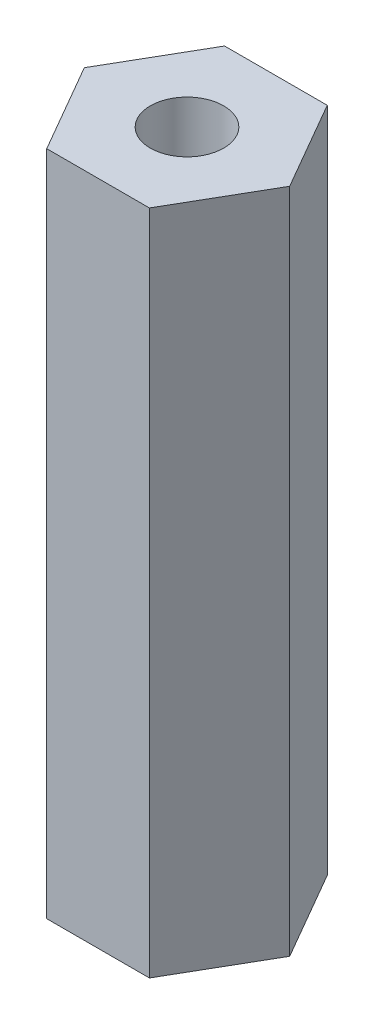
ISO-10303-21;
HEADER;
FILE_DESCRIPTION(('STEP AP214'),'2;1');
FILE_NAME('part.step','',(''),(''),'','','');
FILE_SCHEMA(('AUTOMOTIVE_DESIGN { 1 0 10303 214 1 1 1 1 }'));
ENDSEC;
DATA;
#1=APPLICATION_CONTEXT('core data for automotive mechanical design processes');
#2=APPLICATION_PROTOCOL_DEFINITION('international standard','automotive_design',2000,#1);
#3=PRODUCT_CONTEXT('',#1,'mechanical');
#4=PRODUCT('Part','Part','',(#3));
#5=PRODUCT_RELATED_PRODUCT_CATEGORY('part','',(#4));
#6=PRODUCT_DEFINITION_FORMATION('','',#4);
#7=PRODUCT_DEFINITION_CONTEXT('part definition',#1,'design');
#8=PRODUCT_DEFINITION('design','',#6,#7);
#9=PRODUCT_DEFINITION_SHAPE('','',#8);
#10=(LENGTH_UNIT() NAMED_UNIT(*) SI_UNIT(.MILLI.,.METRE.));
#11=(NAMED_UNIT(*) PLANE_ANGLE_UNIT() SI_UNIT($,.RADIAN.));
#12=(NAMED_UNIT(*) SI_UNIT($,.STERADIAN.) SOLID_ANGLE_UNIT());
#13=UNCERTAINTY_MEASURE_WITH_UNIT(LENGTH_MEASURE(1.E-05),#10,'distance_accuracy_value','');
#14=(GEOMETRIC_REPRESENTATION_CONTEXT(3) GLOBAL_UNCERTAINTY_ASSIGNED_CONTEXT((#13)) GLOBAL_UNIT_ASSIGNED_CONTEXT((#10,
#11,#12)) REPRESENTATION_CONTEXT('',''));
#15=CARTESIAN_POINT('',(0.,0.,0.));
#16=DIRECTION('',(0.,0.,1.));
#17=DIRECTION('',(1.,0.,0.));
#18=AXIS2_PLACEMENT_3D('',#15,#16,#17);
#19=CARTESIAN_POINT('',(0.,15.,4.));
#20=DIRECTION('',(0.,0.,-1.));
#21=DIRECTION('',(-1.,0.,0.));
#22=AXIS2_PLACEMENT_3D('',#19,#20,#21);
#23=PLANE('',#22);
#24=DIRECTION('',(1.,0.,0.));
#25=VECTOR('',#24,1.);
#26=CARTESIAN_POINT('',(0.,-15.,4.));
#27=LINE('',#26,#25);
#28=CARTESIAN_POINT('',(-2.3094010767585,-15.,4.));
#29=VERTEX_POINT('',#28);
#30=CARTESIAN_POINT('',(2.3094010767585,-15.,4.));
#31=VERTEX_POINT('',#30);
#32=EDGE_CURVE('E123',#29,#31,#27,.T.);
#33=ORIENTED_EDGE('',*,*,#32,.T.);
#34=DIRECTION('',(0.,-1.,0.));
#35=VECTOR('',#34,1.);
#36=CARTESIAN_POINT('',(2.3094010767585,15.,4.));
#37=LINE('',#36,#35);
#38=CARTESIAN_POINT('',(2.3094010767585,15.,4.));
#39=VERTEX_POINT('',#38);
#40=EDGE_CURVE('E11',#39,#31,#37,.T.);
#41=ORIENTED_EDGE('',*,*,#40,.F.);
#42=DIRECTION('',(1.,0.,0.));
#43=VECTOR('',#42,1.);
#44=CARTESIAN_POINT('',(0.,15.,4.));
#45=LINE('',#44,#43);
#46=CARTESIAN_POINT('',(-2.3094010767585,15.,4.));
#47=VERTEX_POINT('',#46);
#48=EDGE_CURVE('E146',#47,#39,#45,.T.);
#49=ORIENTED_EDGE('',*,*,#48,.F.);
#50=DIRECTION('',(0.,-1.,0.));
#51=VECTOR('',#50,1.);
#52=CARTESIAN_POINT('',(-2.3094010767585,15.,4.));
#53=LINE('',#52,#51);
#54=EDGE_CURVE('E116',#47,#29,#53,.T.);
#55=ORIENTED_EDGE('',*,*,#54,.T.);
#56=EDGE_LOOP('',(#33,#41,#49,#55));
#57=FACE_BOUND('',#56,.T.);
#58=ADVANCED_FACE('F35',(#57),#23,.F.);
#59=CARTESIAN_POINT('',(3.46410161513775,15.,2.));
#60=DIRECTION('',(-0.866025403784439,0.,-0.5));
#61=DIRECTION('',(-0.5,0.,0.866025403784439));
#62=AXIS2_PLACEMENT_3D('',#59,#60,#61);
#63=PLANE('',#62);
#64=DIRECTION('',(0.5,0.,-0.866025403784439));
#65=VECTOR('',#64,1.);
#66=CARTESIAN_POINT('',(3.46410161513775,-15.,2.));
#67=LINE('',#66,#65);
#68=CARTESIAN_POINT('',(4.618802153517,-15.,0.));
#69=VERTEX_POINT('',#68);
#70=EDGE_CURVE('E126',#31,#69,#67,.T.);
#71=ORIENTED_EDGE('',*,*,#70,.T.);
#72=DIRECTION('',(0.,-1.,0.));
#73=VECTOR('',#72,1.);
#74=CARTESIAN_POINT('',(4.618802153517,15.,0.));
#75=LINE('',#74,#73);
#76=CARTESIAN_POINT('',(4.618802153517,15.,0.));
#77=VERTEX_POINT('',#76);
#78=EDGE_CURVE('E44',#77,#69,#75,.T.);
#79=ORIENTED_EDGE('',*,*,#78,.F.);
#80=DIRECTION('',(0.5,0.,-0.866025403784439));
#81=VECTOR('',#80,1.);
#82=CARTESIAN_POINT('',(3.46410161513775,15.,2.));
#83=LINE('',#82,#81);
#84=EDGE_CURVE('E89',#39,#77,#83,.T.);
#85=ORIENTED_EDGE('',*,*,#84,.F.);
#86=ORIENTED_EDGE('',*,*,#40,.T.);
#87=EDGE_LOOP('',(#71,#79,#85,#86));
#88=FACE_BOUND('',#87,.T.);
#89=ADVANCED_FACE('F160',(#88),#63,.F.);
#90=CARTESIAN_POINT('',(3.46410161513775,15.,-2.));
#91=DIRECTION('',(-0.866025403784439,0.,0.5));
#92=DIRECTION('',(0.5,0.,0.866025403784439));
#93=AXIS2_PLACEMENT_3D('',#90,#91,#92);
#94=PLANE('',#93);
#95=DIRECTION('',(-0.5,0.,-0.866025403784439));
#96=VECTOR('',#95,1.);
#97=CARTESIAN_POINT('',(3.46410161513775,-15.,-2.));
#98=LINE('',#97,#96);
#99=CARTESIAN_POINT('',(2.3094010767585,-15.,-4.));
#100=VERTEX_POINT('',#99);
#101=EDGE_CURVE('E128',#69,#100,#98,.T.);
#102=ORIENTED_EDGE('',*,*,#101,.T.);
#103=DIRECTION('',(0.,-1.,0.));
#104=VECTOR('',#103,1.);
#105=CARTESIAN_POINT('',(2.3094010767585,15.,-4.));
#106=LINE('',#105,#104);
#107=CARTESIAN_POINT('',(2.3094010767585,15.,-4.));
#108=VERTEX_POINT('',#107);
#109=EDGE_CURVE('E111',#108,#100,#106,.T.);
#110=ORIENTED_EDGE('',*,*,#109,.F.);
#111=DIRECTION('',(-0.5,0.,-0.866025403784439));
#112=VECTOR('',#111,1.);
#113=CARTESIAN_POINT('',(3.46410161513775,15.,-2.));
#114=LINE('',#113,#112);
#115=EDGE_CURVE('E102',#77,#108,#114,.T.);
#116=ORIENTED_EDGE('',*,*,#115,.F.);
#117=ORIENTED_EDGE('',*,*,#78,.T.);
#118=EDGE_LOOP('',(#102,#110,#116,#117));
#119=FACE_BOUND('',#118,.T.);
#120=ADVANCED_FACE('F139',(#119),#94,.F.);
#121=CARTESIAN_POINT('',(0.,15.,-4.));
#122=DIRECTION('',(0.,0.,1.));
#123=DIRECTION('',(1.,0.,0.));
#124=AXIS2_PLACEMENT_3D('',#121,#122,#123);
#125=PLANE('',#124);
#126=DIRECTION('',(-1.,0.,0.));
#127=VECTOR('',#126,1.);
#128=CARTESIAN_POINT('',(0.,-15.,-4.));
#129=LINE('',#128,#127);
#130=CARTESIAN_POINT('',(-2.3094010767585,-15.,-4.));
#131=VERTEX_POINT('',#130);
#132=EDGE_CURVE('E110',#100,#131,#129,.T.);
#133=ORIENTED_EDGE('',*,*,#132,.T.);
#134=DIRECTION('',(0.,-1.,0.));
#135=VECTOR('',#134,1.);
#136=CARTESIAN_POINT('',(-2.3094010767585,15.,-4.));
#137=LINE('',#136,#135);
#138=CARTESIAN_POINT('',(-2.3094010767585,15.,-4.));
#139=VERTEX_POINT('',#138);
#140=EDGE_CURVE('E107',#139,#131,#137,.T.);
#141=ORIENTED_EDGE('',*,*,#140,.F.);
#142=DIRECTION('',(-1.,0.,0.));
#143=VECTOR('',#142,1.);
#144=CARTESIAN_POINT('',(0.,15.,-4.));
#145=LINE('',#144,#143);
#146=EDGE_CURVE('E96',#108,#139,#145,.T.);
#147=ORIENTED_EDGE('',*,*,#146,.F.);
#148=ORIENTED_EDGE('',*,*,#109,.T.);
#149=EDGE_LOOP('',(#133,#141,#147,#148));
#150=FACE_BOUND('',#149,.T.);
#151=ADVANCED_FACE('F108',(#150),#125,.F.);
#152=CARTESIAN_POINT('',(-3.46410161513775,15.,-2.));
#153=DIRECTION('',(0.866025403784439,0.,0.5));
#154=DIRECTION('',(0.5,0.,-0.866025403784439));
#155=AXIS2_PLACEMENT_3D('',#152,#153,#154);
#156=PLANE('',#155);
#157=DIRECTION('',(-0.5,0.,0.866025403784439));
#158=VECTOR('',#157,1.);
#159=CARTESIAN_POINT('',(-3.46410161513775,-15.,-2.));
#160=LINE('',#159,#158);
#161=CARTESIAN_POINT('',(-4.61880215351701,-15.,0.));
#162=VERTEX_POINT('',#161);
#163=EDGE_CURVE('E75',#131,#162,#160,.T.);
#164=ORIENTED_EDGE('',*,*,#163,.T.);
#165=DIRECTION('',(0.,-1.,0.));
#166=VECTOR('',#165,1.);
#167=CARTESIAN_POINT('',(-4.61880215351701,15.,0.));
#168=LINE('',#167,#166);
#169=CARTESIAN_POINT('',(-4.61880215351701,15.,0.));
#170=VERTEX_POINT('',#169);
#171=EDGE_CURVE('E112',#170,#162,#168,.T.);
#172=ORIENTED_EDGE('',*,*,#171,.F.);
#173=DIRECTION('',(-0.5,0.,0.866025403784439));
#174=VECTOR('',#173,1.);
#175=CARTESIAN_POINT('',(-3.46410161513775,15.,-2.));
#176=LINE('',#175,#174);
#177=EDGE_CURVE('E100',#139,#170,#176,.T.);
#178=ORIENTED_EDGE('',*,*,#177,.F.);
#179=ORIENTED_EDGE('',*,*,#140,.T.);
#180=EDGE_LOOP('',(#164,#172,#178,#179));
#181=FACE_BOUND('',#180,.T.);
#182=ADVANCED_FACE('F114',(#181),#156,.F.);
#183=CARTESIAN_POINT('',(0.,15.,0.));
#184=DIRECTION('',(0.,-1.,0.));
#185=DIRECTION('',(0.,0.,-1.));
#186=AXIS2_PLACEMENT_3D('',#183,#184,#185);
#187=CYLINDRICAL_SURFACE('',#186,1.65);
#188=CARTESIAN_POINT('',(0.,15.,0.));
#189=DIRECTION('',(0.,1.,0.));
#190=DIRECTION('',(0.,0.,1.));
#191=AXIS2_PLACEMENT_3D('',#188,#189,#190);
#192=CIRCLE('',#191,1.65);
#193=CARTESIAN_POINT('',(0.,15.,1.65));
#194=VERTEX_POINT('',#193);
#195=EDGE_CURVE('E133',#194,#194,#192,.T.);
#196=ORIENTED_EDGE('',*,*,#195,.T.);
#197=EDGE_LOOP('',(#196));
#198=FACE_BOUND('',#197,.T.);
#199=CARTESIAN_POINT('',(0.,-15.,0.));
#200=DIRECTION('',(0.,1.,0.));
#201=DIRECTION('',(0.,0.,1.));
#202=AXIS2_PLACEMENT_3D('',#199,#200,#201);
#203=CIRCLE('',#202,1.65);
#204=CARTESIAN_POINT('',(0.,-15.,1.65));
#205=VERTEX_POINT('',#204);
#206=EDGE_CURVE('E120',#205,#205,#203,.T.);
#207=ORIENTED_EDGE('',*,*,#206,.F.);
#208=EDGE_LOOP('',(#207));
#209=FACE_BOUND('',#208,.T.);
#210=ADVANCED_FACE('F37',(#198,#209),#187,.F.);
#211=CARTESIAN_POINT('',(-3.46410161513775,15.,2.));
#212=DIRECTION('',(0.866025403784439,0.,-0.5));
#213=DIRECTION('',(-0.5,0.,-0.866025403784439));
#214=AXIS2_PLACEMENT_3D('',#211,#212,#213);
#215=PLANE('',#214);
#216=DIRECTION('',(0.5,0.,0.866025403784439));
#217=VECTOR('',#216,1.);
#218=CARTESIAN_POINT('',(-3.46410161513775,-15.,2.));
#219=LINE('',#218,#217);
#220=EDGE_CURVE('E81',#162,#29,#219,.T.);
#221=ORIENTED_EDGE('',*,*,#220,.T.);
#222=ORIENTED_EDGE('',*,*,#54,.F.);
#223=DIRECTION('',(0.5,0.,0.866025403784439));
#224=VECTOR('',#223,1.);
#225=CARTESIAN_POINT('',(-3.46410161513775,15.,2.));
#226=LINE('',#225,#224);
#227=EDGE_CURVE('E52',#170,#47,#226,.T.);
#228=ORIENTED_EDGE('',*,*,#227,.F.);
#229=ORIENTED_EDGE('',*,*,#171,.T.);
#230=EDGE_LOOP('',(#221,#222,#228,#229));
#231=FACE_BOUND('',#230,.T.);
#232=ADVANCED_FACE('F147',(#231),#215,.F.);
#233=CARTESIAN_POINT('',(0.,15.,0.));
#234=DIRECTION('',(0.,1.,0.));
#235=DIRECTION('',(0.,0.,1.));
#236=AXIS2_PLACEMENT_3D('',#233,#234,#235);
#237=PLANE('',#236);
#238=ORIENTED_EDGE('',*,*,#195,.F.);
#239=EDGE_LOOP('',(#238));
#240=FACE_BOUND('',#239,.T.);
#241=ORIENTED_EDGE('',*,*,#48,.T.);
#242=ORIENTED_EDGE('',*,*,#84,.T.);
#243=ORIENTED_EDGE('',*,*,#115,.T.);
#244=ORIENTED_EDGE('',*,*,#146,.T.);
#245=ORIENTED_EDGE('',*,*,#177,.T.);
#246=ORIENTED_EDGE('',*,*,#227,.T.);
#247=EDGE_LOOP('',(#241,#242,#243,#244,#245,#246));
#248=FACE_BOUND('',#247,.T.);
#249=ADVANCED_FACE('F98',(#240,#248),#237,.T.);
#250=CARTESIAN_POINT('',(0.,-15.,0.));
#251=DIRECTION('',(0.,1.,0.));
#252=DIRECTION('',(0.,0.,1.));
#253=AXIS2_PLACEMENT_3D('',#250,#251,#252);
#254=PLANE('',#253);
#255=ORIENTED_EDGE('',*,*,#206,.T.);
#256=EDGE_LOOP('',(#255));
#257=FACE_BOUND('',#256,.T.);
#258=ORIENTED_EDGE('',*,*,#32,.F.);
#259=ORIENTED_EDGE('',*,*,#220,.F.);
#260=ORIENTED_EDGE('',*,*,#163,.F.);
#261=ORIENTED_EDGE('',*,*,#132,.F.);
#262=ORIENTED_EDGE('',*,*,#101,.F.);
#263=ORIENTED_EDGE('',*,*,#70,.F.);
#264=EDGE_LOOP('',(#258,#259,#260,#261,#262,#263));
#265=FACE_BOUND('',#264,.T.);
#266=ADVANCED_FACE('F142',(#257,#265),#254,.F.);
#267=CLOSED_SHELL('',(#58,#89,#120,#151,#182,#210,#232,#249,#266));
#268=MANIFOLD_SOLID_BREP('B2',#267);
#269=ADVANCED_BREP_SHAPE_REPRESENTATION('',(#18,#268),#14);
#270=SHAPE_DEFINITION_REPRESENTATION(#9,#269);
ENDSEC;
END-ISO-10303-21;
